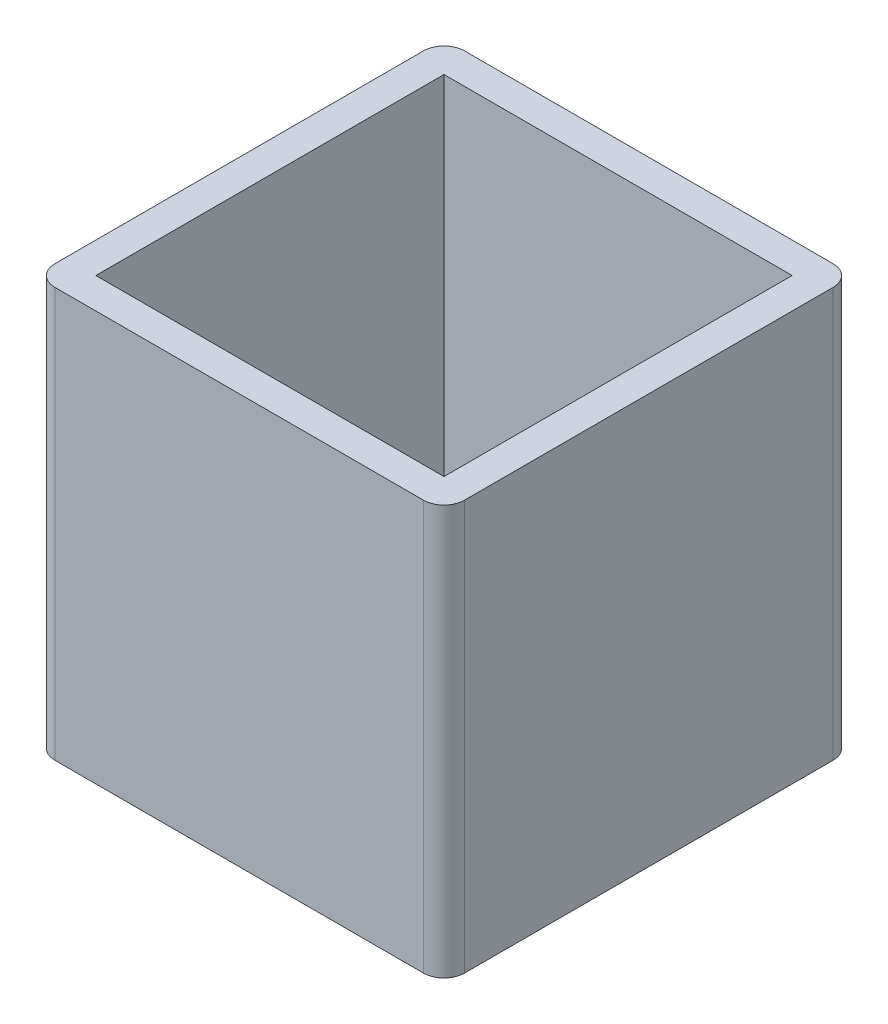
ISO-10303-21;
HEADER;
FILE_DESCRIPTION(('STEP AP214'),'2;1');
FILE_NAME('part.step','',(''),(''),'','','');
FILE_SCHEMA(('AUTOMOTIVE_DESIGN { 1 0 10303 214 1 1 1 1 }'));
ENDSEC;
DATA;
#1=APPLICATION_CONTEXT('core data for automotive mechanical design processes');
#2=APPLICATION_PROTOCOL_DEFINITION('international standard','automotive_design',2000,#1);
#3=PRODUCT_CONTEXT('',#1,'mechanical');
#4=PRODUCT('Part','Part','',(#3));
#5=PRODUCT_RELATED_PRODUCT_CATEGORY('part','',(#4));
#6=PRODUCT_DEFINITION_FORMATION('','',#4);
#7=PRODUCT_DEFINITION_CONTEXT('part definition',#1,'design');
#8=PRODUCT_DEFINITION('design','',#6,#7);
#9=PRODUCT_DEFINITION_SHAPE('','',#8);
#10=(LENGTH_UNIT() NAMED_UNIT(*) SI_UNIT(.MILLI.,.METRE.));
#11=(NAMED_UNIT(*) PLANE_ANGLE_UNIT() SI_UNIT($,.RADIAN.));
#12=(NAMED_UNIT(*) SI_UNIT($,.STERADIAN.) SOLID_ANGLE_UNIT());
#13=UNCERTAINTY_MEASURE_WITH_UNIT(LENGTH_MEASURE(1.E-05),#10,'distance_accuracy_value','');
#14=(GEOMETRIC_REPRESENTATION_CONTEXT(3) GLOBAL_UNCERTAINTY_ASSIGNED_CONTEXT((#13)) GLOBAL_UNIT_ASSIGNED_CONTEXT((#10,
#11,#12)) REPRESENTATION_CONTEXT('',''));
#15=CARTESIAN_POINT('',(0.,0.,0.));
#16=DIRECTION('',(0.,0.,1.));
#17=DIRECTION('',(1.,0.,0.));
#18=AXIS2_PLACEMENT_3D('',#15,#16,#17);
#19=CARTESIAN_POINT('',(0.,40.,0.));
#20=DIRECTION('',(0.,1.,0.));
#21=DIRECTION('',(0.,0.,1.));
#22=AXIS2_PLACEMENT_3D('',#19,#20,#21);
#23=PLANE('',#22);
#24=DIRECTION('',(-1.,0.,0.));
#25=VECTOR('',#24,1.);
#26=CARTESIAN_POINT('',(0.,40.,0.));
#27=LINE('',#26,#25);
#28=CARTESIAN_POINT('',(38.,40.,0.));
#29=VERTEX_POINT('',#28);
#30=CARTESIAN_POINT('',(2.,40.,0.));
#31=VERTEX_POINT('',#30);
#32=EDGE_CURVE('E180',#29,#31,#27,.T.);
#33=ORIENTED_EDGE('',*,*,#32,.T.);
#34=CARTESIAN_POINT('',(2.,40.,2.));
#35=DIRECTION('',(0.,1.,0.));
#36=DIRECTION('',(0.,0.,1.));
#37=AXIS2_PLACEMENT_3D('',#34,#35,#36);
#38=CIRCLE('',#37,2.);
#39=CARTESIAN_POINT('',(0.,40.,2.));
#40=VERTEX_POINT('',#39);
#41=EDGE_CURVE('E227',#31,#40,#38,.T.);
#42=ORIENTED_EDGE('',*,*,#41,.T.);
#43=DIRECTION('',(0.,0.,1.));
#44=VECTOR('',#43,1.);
#45=CARTESIAN_POINT('',(0.,40.,0.));
#46=LINE('',#45,#44);
#47=CARTESIAN_POINT('',(0.,40.,38.));
#48=VERTEX_POINT('',#47);
#49=EDGE_CURVE('E169',#40,#48,#46,.T.);
#50=ORIENTED_EDGE('',*,*,#49,.T.);
#51=CARTESIAN_POINT('',(2.,40.,38.));
#52=DIRECTION('',(0.,1.,0.));
#53=DIRECTION('',(0.,0.,1.));
#54=AXIS2_PLACEMENT_3D('',#51,#52,#53);
#55=CIRCLE('',#54,2.);
#56=CARTESIAN_POINT('',(2.,40.,40.));
#57=VERTEX_POINT('',#56);
#58=EDGE_CURVE('E224',#48,#57,#55,.T.);
#59=ORIENTED_EDGE('',*,*,#58,.T.);
#60=DIRECTION('',(1.,0.,0.));
#61=VECTOR('',#60,1.);
#62=CARTESIAN_POINT('',(0.,40.,40.));
#63=LINE('',#62,#61);
#64=CARTESIAN_POINT('',(38.,40.,40.));
#65=VERTEX_POINT('',#64);
#66=EDGE_CURVE('E173',#57,#65,#63,.T.);
#67=ORIENTED_EDGE('',*,*,#66,.T.);
#68=CARTESIAN_POINT('',(38.,40.,38.));
#69=DIRECTION('',(0.,1.,0.));
#70=DIRECTION('',(0.,0.,1.));
#71=AXIS2_PLACEMENT_3D('',#68,#69,#70);
#72=CIRCLE('',#71,2.);
#73=CARTESIAN_POINT('',(40.,40.,38.));
#74=VERTEX_POINT('',#73);
#75=EDGE_CURVE('E61',#65,#74,#72,.T.);
#76=ORIENTED_EDGE('',*,*,#75,.T.);
#77=DIRECTION('',(0.,0.,-1.));
#78=VECTOR('',#77,1.);
#79=CARTESIAN_POINT('',(40.,40.,0.));
#80=LINE('',#79,#78);
#81=CARTESIAN_POINT('',(40.,40.,2.));
#82=VERTEX_POINT('',#81);
#83=EDGE_CURVE('E177',#74,#82,#80,.T.);
#84=ORIENTED_EDGE('',*,*,#83,.T.);
#85=CARTESIAN_POINT('',(38.,40.,2.));
#86=DIRECTION('',(0.,1.,0.));
#87=DIRECTION('',(0.,0.,1.));
#88=AXIS2_PLACEMENT_3D('',#85,#86,#87);
#89=CIRCLE('',#88,2.);
#90=EDGE_CURVE('E219',#82,#29,#89,.T.);
#91=ORIENTED_EDGE('',*,*,#90,.T.);
#92=EDGE_LOOP('',(#33,#42,#50,#59,#67,#76,#84,#91));
#93=FACE_BOUND('',#92,.T.);
#94=DIRECTION('',(0.,0.,1.));
#95=VECTOR('',#94,1.);
#96=CARTESIAN_POINT('',(3.,40.,3.));
#97=LINE('',#96,#95);
#98=CARTESIAN_POINT('',(3.,40.,3.));
#99=VERTEX_POINT('',#98);
#100=CARTESIAN_POINT('',(3.,40.,37.));
#101=VERTEX_POINT('',#100);
#102=EDGE_CURVE('E151',#99,#101,#97,.T.);
#103=ORIENTED_EDGE('',*,*,#102,.F.);
#104=DIRECTION('',(1.,0.,0.));
#105=VECTOR('',#104,1.);
#106=CARTESIAN_POINT('',(3.,40.,3.));
#107=LINE('',#106,#105);
#108=CARTESIAN_POINT('',(37.,40.,3.));
#109=VERTEX_POINT('',#108);
#110=EDGE_CURVE('E403',#99,#109,#107,.T.);
#111=ORIENTED_EDGE('',*,*,#110,.T.);
#112=DIRECTION('',(0.,0.,1.));
#113=VECTOR('',#112,1.);
#114=CARTESIAN_POINT('',(37.,40.,3.));
#115=LINE('',#114,#113);
#116=CARTESIAN_POINT('',(37.,40.,37.));
#117=VERTEX_POINT('',#116);
#118=EDGE_CURVE('E155',#109,#117,#115,.T.);
#119=ORIENTED_EDGE('',*,*,#118,.T.);
#120=DIRECTION('',(1.,0.,0.));
#121=VECTOR('',#120,1.);
#122=CARTESIAN_POINT('',(3.,40.,37.));
#123=LINE('',#122,#121);
#124=EDGE_CURVE('E397',#101,#117,#123,.T.);
#125=ORIENTED_EDGE('',*,*,#124,.F.);
#126=EDGE_LOOP('',(#103,#111,#119,#125));
#127=FACE_BOUND('',#126,.T.);
#128=ADVANCED_FACE('F39',(#93,#127),#23,.T.);
#129=CARTESIAN_POINT('',(0.,40.,0.));
#130=DIRECTION('',(1.,0.,0.));
#131=DIRECTION('',(0.,0.,-1.));
#132=AXIS2_PLACEMENT_3D('',#129,#130,#131);
#133=PLANE('',#132);
#134=ORIENTED_EDGE('',*,*,#49,.F.);
#135=DIRECTION('',(0.,-1.,0.));
#136=VECTOR('',#135,1.);
#137=CARTESIAN_POINT('',(0.,40.,2.));
#138=LINE('',#137,#136);
#139=CARTESIAN_POINT('',(0.,0.,2.));
#140=VERTEX_POINT('',#139);
#141=EDGE_CURVE('E196',#40,#140,#138,.T.);
#142=ORIENTED_EDGE('',*,*,#141,.T.);
#143=DIRECTION('',(0.,0.,1.));
#144=VECTOR('',#143,1.);
#145=CARTESIAN_POINT('',(0.,0.,0.));
#146=LINE('',#145,#144);
#147=CARTESIAN_POINT('',(0.,0.,38.));
#148=VERTEX_POINT('',#147);
#149=EDGE_CURVE('E157',#140,#148,#146,.T.);
#150=ORIENTED_EDGE('',*,*,#149,.T.);
#151=DIRECTION('',(0.,-1.,0.));
#152=VECTOR('',#151,1.);
#153=CARTESIAN_POINT('',(0.,40.,38.));
#154=LINE('',#153,#152);
#155=EDGE_CURVE('E183',#148,#48,#154,.F.);
#156=ORIENTED_EDGE('',*,*,#155,.T.);
#157=EDGE_LOOP('',(#134,#142,#150,#156));
#158=FACE_BOUND('',#157,.T.);
#159=ADVANCED_FACE('F268',(#158),#133,.F.);
#160=CARTESIAN_POINT('',(0.,40.,40.));
#161=DIRECTION('',(0.,0.,-1.));
#162=DIRECTION('',(-1.,0.,0.));
#163=AXIS2_PLACEMENT_3D('',#160,#161,#162);
#164=PLANE('',#163);
#165=ORIENTED_EDGE('',*,*,#66,.F.);
#166=DIRECTION('',(0.,-1.,0.));
#167=VECTOR('',#166,1.);
#168=CARTESIAN_POINT('',(2.,40.,40.));
#169=LINE('',#168,#167);
#170=CARTESIAN_POINT('',(2.,0.,40.));
#171=VERTEX_POINT('',#170);
#172=EDGE_CURVE('E233',#57,#171,#169,.T.);
#173=ORIENTED_EDGE('',*,*,#172,.T.);
#174=DIRECTION('',(1.,0.,0.));
#175=VECTOR('',#174,1.);
#176=CARTESIAN_POINT('',(0.,0.,40.));
#177=LINE('',#176,#175);
#178=CARTESIAN_POINT('',(38.,0.,40.));
#179=VERTEX_POINT('',#178);
#180=EDGE_CURVE('E163',#171,#179,#177,.T.);
#181=ORIENTED_EDGE('',*,*,#180,.T.);
#182=DIRECTION('',(0.,-1.,0.));
#183=VECTOR('',#182,1.);
#184=CARTESIAN_POINT('',(38.,40.,40.));
#185=LINE('',#184,#183);
#186=EDGE_CURVE('E230',#179,#65,#185,.F.);
#187=ORIENTED_EDGE('',*,*,#186,.T.);
#188=EDGE_LOOP('',(#165,#173,#181,#187));
#189=FACE_BOUND('',#188,.T.);
#190=ADVANCED_FACE('F241',(#189),#164,.F.);
#191=CARTESIAN_POINT('',(40.,40.,0.));
#192=DIRECTION('',(-1.,0.,0.));
#193=DIRECTION('',(0.,0.,1.));
#194=AXIS2_PLACEMENT_3D('',#191,#192,#193);
#195=PLANE('',#194);
#196=ORIENTED_EDGE('',*,*,#83,.F.);
#197=DIRECTION('',(0.,-1.,0.));
#198=VECTOR('',#197,1.);
#199=CARTESIAN_POINT('',(40.,40.,38.));
#200=LINE('',#199,#198);
#201=CARTESIAN_POINT('',(40.,0.,38.));
#202=VERTEX_POINT('',#201);
#203=EDGE_CURVE('E11',#74,#202,#200,.T.);
#204=ORIENTED_EDGE('',*,*,#203,.T.);
#205=DIRECTION('',(0.,0.,-1.));
#206=VECTOR('',#205,1.);
#207=CARTESIAN_POINT('',(40.,0.,0.));
#208=LINE('',#207,#206);
#209=CARTESIAN_POINT('',(40.,0.,2.));
#210=VERTEX_POINT('',#209);
#211=EDGE_CURVE('E188',#202,#210,#208,.T.);
#212=ORIENTED_EDGE('',*,*,#211,.T.);
#213=DIRECTION('',(0.,-1.,0.));
#214=VECTOR('',#213,1.);
#215=CARTESIAN_POINT('',(40.,40.,2.));
#216=LINE('',#215,#214);
#217=EDGE_CURVE('E48',#210,#82,#216,.F.);
#218=ORIENTED_EDGE('',*,*,#217,.T.);
#219=EDGE_LOOP('',(#196,#204,#212,#218));
#220=FACE_BOUND('',#219,.T.);
#221=ADVANCED_FACE('F252',(#220),#195,.F.);
#222=CARTESIAN_POINT('',(0.,40.,0.));
#223=DIRECTION('',(0.,0.,1.));
#224=DIRECTION('',(1.,0.,0.));
#225=AXIS2_PLACEMENT_3D('',#222,#223,#224);
#226=PLANE('',#225);
#227=DIRECTION('',(-1.,0.,0.));
#228=VECTOR('',#227,1.);
#229=CARTESIAN_POINT('',(0.,0.,0.));
#230=LINE('',#229,#228);
#231=CARTESIAN_POINT('',(38.,0.,0.));
#232=VERTEX_POINT('',#231);
#233=CARTESIAN_POINT('',(2.,0.,0.));
#234=VERTEX_POINT('',#233);
#235=EDGE_CURVE('E174',#232,#234,#230,.T.);
#236=ORIENTED_EDGE('',*,*,#235,.T.);
#237=DIRECTION('',(0.,-1.,0.));
#238=VECTOR('',#237,1.);
#239=CARTESIAN_POINT('',(2.,40.,0.));
#240=LINE('',#239,#238);
#241=EDGE_CURVE('E216',#234,#31,#240,.F.);
#242=ORIENTED_EDGE('',*,*,#241,.T.);
#243=ORIENTED_EDGE('',*,*,#32,.F.);
#244=DIRECTION('',(0.,-1.,0.));
#245=VECTOR('',#244,1.);
#246=CARTESIAN_POINT('',(38.,40.,0.));
#247=LINE('',#246,#245);
#248=EDGE_CURVE('E212',#29,#232,#247,.T.);
#249=ORIENTED_EDGE('',*,*,#248,.T.);
#250=EDGE_LOOP('',(#236,#242,#243,#249));
#251=FACE_BOUND('',#250,.T.);
#252=ADVANCED_FACE('F260',(#251),#226,.F.);
#253=CARTESIAN_POINT('',(0.,0.,0.));
#254=DIRECTION('',(0.,1.,0.));
#255=DIRECTION('',(0.,0.,1.));
#256=AXIS2_PLACEMENT_3D('',#253,#254,#255);
#257=PLANE('',#256);
#258=ORIENTED_EDGE('',*,*,#149,.F.);
#259=CARTESIAN_POINT('',(2.,0.,2.));
#260=DIRECTION('',(0.,1.,0.));
#261=DIRECTION('',(0.,0.,1.));
#262=AXIS2_PLACEMENT_3D('',#259,#260,#261);
#263=CIRCLE('',#262,2.);
#264=EDGE_CURVE('E209',#140,#234,#263,.F.);
#265=ORIENTED_EDGE('',*,*,#264,.T.);
#266=ORIENTED_EDGE('',*,*,#235,.F.);
#267=CARTESIAN_POINT('',(38.,0.,2.));
#268=DIRECTION('',(0.,1.,0.));
#269=DIRECTION('',(0.,0.,1.));
#270=AXIS2_PLACEMENT_3D('',#267,#268,#269);
#271=CIRCLE('',#270,2.);
#272=EDGE_CURVE('E200',#232,#210,#271,.F.);
#273=ORIENTED_EDGE('',*,*,#272,.T.);
#274=ORIENTED_EDGE('',*,*,#211,.F.);
#275=CARTESIAN_POINT('',(38.,0.,38.));
#276=DIRECTION('',(0.,1.,0.));
#277=DIRECTION('',(0.,0.,1.));
#278=AXIS2_PLACEMENT_3D('',#275,#276,#277);
#279=CIRCLE('',#278,2.);
#280=EDGE_CURVE('E203',#202,#179,#279,.F.);
#281=ORIENTED_EDGE('',*,*,#280,.T.);
#282=ORIENTED_EDGE('',*,*,#180,.F.);
#283=CARTESIAN_POINT('',(2.,0.,38.));
#284=DIRECTION('',(0.,1.,0.));
#285=DIRECTION('',(0.,0.,1.));
#286=AXIS2_PLACEMENT_3D('',#283,#284,#285);
#287=CIRCLE('',#286,2.);
#288=EDGE_CURVE('E206',#171,#148,#287,.F.);
#289=ORIENTED_EDGE('',*,*,#288,.T.);
#290=EDGE_LOOP('',(#258,#265,#266,#273,#274,#281,#282,#289));
#291=FACE_BOUND('',#290,.T.);
#292=ADVANCED_FACE('F247',(#291),#257,.F.);
#293=CARTESIAN_POINT('',(3.,3.,3.));
#294=DIRECTION('',(0.,0.,1.));
#295=DIRECTION('',(1.,0.,0.));
#296=AXIS2_PLACEMENT_3D('',#293,#294,#295);
#297=PLANE('',#296);
#298=ORIENTED_EDGE('',*,*,#110,.F.);
#299=DIRECTION('',(0.,1.,0.));
#300=VECTOR('',#299,1.);
#301=CARTESIAN_POINT('',(3.,3.,3.));
#302=LINE('',#301,#300);
#303=CARTESIAN_POINT('',(3.,3.,3.));
#304=VERTEX_POINT('',#303);
#305=EDGE_CURVE('E149',#304,#99,#302,.T.);
#306=ORIENTED_EDGE('',*,*,#305,.F.);
#307=DIRECTION('',(1.,0.,0.));
#308=VECTOR('',#307,1.);
#309=CARTESIAN_POINT('',(3.,3.,3.));
#310=LINE('',#309,#308);
#311=CARTESIAN_POINT('',(37.,3.,3.));
#312=VERTEX_POINT('',#311);
#313=EDGE_CURVE('E134',#304,#312,#310,.T.);
#314=ORIENTED_EDGE('',*,*,#313,.T.);
#315=DIRECTION('',(0.,1.,0.));
#316=VECTOR('',#315,1.);
#317=CARTESIAN_POINT('',(37.,3.,3.));
#318=LINE('',#317,#316);
#319=EDGE_CURVE('E146',#312,#109,#318,.T.);
#320=ORIENTED_EDGE('',*,*,#319,.T.);
#321=EDGE_LOOP('',(#298,#306,#314,#320));
#322=FACE_BOUND('',#321,.T.);
#323=ADVANCED_FACE('F145',(#322),#297,.T.);
#324=CARTESIAN_POINT('',(37.,3.,3.));
#325=DIRECTION('',(-1.,0.,0.));
#326=DIRECTION('',(0.,0.,1.));
#327=AXIS2_PLACEMENT_3D('',#324,#325,#326);
#328=PLANE('',#327);
#329=ORIENTED_EDGE('',*,*,#118,.F.);
#330=ORIENTED_EDGE('',*,*,#319,.F.);
#331=DIRECTION('',(0.,0.,1.));
#332=VECTOR('',#331,1.);
#333=CARTESIAN_POINT('',(37.,3.,3.));
#334=LINE('',#333,#332);
#335=CARTESIAN_POINT('',(37.,3.,37.));
#336=VERTEX_POINT('',#335);
#337=EDGE_CURVE('E130',#312,#336,#334,.T.);
#338=ORIENTED_EDGE('',*,*,#337,.T.);
#339=DIRECTION('',(0.,1.,0.));
#340=VECTOR('',#339,1.);
#341=CARTESIAN_POINT('',(37.,3.,37.));
#342=LINE('',#341,#340);
#343=EDGE_CURVE('E158',#336,#117,#342,.T.);
#344=ORIENTED_EDGE('',*,*,#343,.T.);
#345=EDGE_LOOP('',(#329,#330,#338,#344));
#346=FACE_BOUND('',#345,.T.);
#347=ADVANCED_FACE('F153',(#346),#328,.T.);
#348=CARTESIAN_POINT('',(3.,3.,37.));
#349=DIRECTION('',(0.,0.,1.));
#350=DIRECTION('',(1.,0.,0.));
#351=AXIS2_PLACEMENT_3D('',#348,#349,#350);
#352=PLANE('',#351);
#353=ORIENTED_EDGE('',*,*,#124,.T.);
#354=ORIENTED_EDGE('',*,*,#343,.F.);
#355=DIRECTION('',(1.,0.,0.));
#356=VECTOR('',#355,1.);
#357=CARTESIAN_POINT('',(3.,3.,37.));
#358=LINE('',#357,#356);
#359=CARTESIAN_POINT('',(3.,3.,37.));
#360=VERTEX_POINT('',#359);
#361=EDGE_CURVE('E137',#360,#336,#358,.T.);
#362=ORIENTED_EDGE('',*,*,#361,.F.);
#363=DIRECTION('',(0.,1.,0.));
#364=VECTOR('',#363,1.);
#365=CARTESIAN_POINT('',(3.,3.,37.));
#366=LINE('',#365,#364);
#367=EDGE_CURVE('E165',#360,#101,#366,.T.);
#368=ORIENTED_EDGE('',*,*,#367,.T.);
#369=EDGE_LOOP('',(#353,#354,#362,#368));
#370=FACE_BOUND('',#369,.T.);
#371=ADVANCED_FACE('F322',(#370),#352,.F.);
#372=CARTESIAN_POINT('',(3.,3.,3.));
#373=DIRECTION('',(-1.,0.,0.));
#374=DIRECTION('',(0.,0.,1.));
#375=AXIS2_PLACEMENT_3D('',#372,#373,#374);
#376=PLANE('',#375);
#377=ORIENTED_EDGE('',*,*,#102,.T.);
#378=ORIENTED_EDGE('',*,*,#367,.F.);
#379=DIRECTION('',(0.,0.,1.));
#380=VECTOR('',#379,1.);
#381=CARTESIAN_POINT('',(3.,3.,3.));
#382=LINE('',#381,#380);
#383=EDGE_CURVE('E408',#304,#360,#382,.T.);
#384=ORIENTED_EDGE('',*,*,#383,.F.);
#385=ORIENTED_EDGE('',*,*,#305,.T.);
#386=EDGE_LOOP('',(#377,#378,#384,#385));
#387=FACE_BOUND('',#386,.T.);
#388=ADVANCED_FACE('F328',(#387),#376,.F.);
#389=CARTESIAN_POINT('',(0.,3.,0.));
#390=DIRECTION('',(0.,-1.,0.));
#391=DIRECTION('',(0.,0.,-1.));
#392=AXIS2_PLACEMENT_3D('',#389,#390,#391);
#393=PLANE('',#392);
#394=ORIENTED_EDGE('',*,*,#313,.F.);
#395=ORIENTED_EDGE('',*,*,#383,.T.);
#396=ORIENTED_EDGE('',*,*,#361,.T.);
#397=ORIENTED_EDGE('',*,*,#337,.F.);
#398=EDGE_LOOP('',(#394,#395,#396,#397));
#399=FACE_BOUND('',#398,.T.);
#400=ADVANCED_FACE('F132',(#399),#393,.F.);
#401=CARTESIAN_POINT('',(2.,40.,2.));
#402=DIRECTION('',(0.,-1.,0.));
#403=DIRECTION('',(0.,0.,-1.));
#404=AXIS2_PLACEMENT_3D('',#401,#402,#403);
#405=CYLINDRICAL_SURFACE('',#404,2.);
#406=ORIENTED_EDGE('',*,*,#41,.F.);
#407=ORIENTED_EDGE('',*,*,#241,.F.);
#408=ORIENTED_EDGE('',*,*,#264,.F.);
#409=ORIENTED_EDGE('',*,*,#141,.F.);
#410=EDGE_LOOP('',(#406,#407,#408,#409));
#411=FACE_BOUND('',#410,.T.);
#412=ADVANCED_FACE('F265',(#411),#405,.T.);
#413=CARTESIAN_POINT('',(2.,40.,38.));
#414=DIRECTION('',(0.,-1.,0.));
#415=DIRECTION('',(0.,0.,-1.));
#416=AXIS2_PLACEMENT_3D('',#413,#414,#415);
#417=CYLINDRICAL_SURFACE('',#416,2.);
#418=ORIENTED_EDGE('',*,*,#58,.F.);
#419=ORIENTED_EDGE('',*,*,#155,.F.);
#420=ORIENTED_EDGE('',*,*,#288,.F.);
#421=ORIENTED_EDGE('',*,*,#172,.F.);
#422=EDGE_LOOP('',(#418,#419,#420,#421));
#423=FACE_BOUND('',#422,.T.);
#424=ADVANCED_FACE('F270',(#423),#417,.T.);
#425=CARTESIAN_POINT('',(38.,40.,38.));
#426=DIRECTION('',(0.,-1.,0.));
#427=DIRECTION('',(0.,0.,-1.));
#428=AXIS2_PLACEMENT_3D('',#425,#426,#427);
#429=CYLINDRICAL_SURFACE('',#428,2.);
#430=ORIENTED_EDGE('',*,*,#75,.F.);
#431=ORIENTED_EDGE('',*,*,#186,.F.);
#432=ORIENTED_EDGE('',*,*,#280,.F.);
#433=ORIENTED_EDGE('',*,*,#203,.F.);
#434=EDGE_LOOP('',(#430,#431,#432,#433));
#435=FACE_BOUND('',#434,.T.);
#436=ADVANCED_FACE('F251',(#435),#429,.T.);
#437=CARTESIAN_POINT('',(38.,40.,2.));
#438=DIRECTION('',(0.,-1.,0.));
#439=DIRECTION('',(0.,0.,-1.));
#440=AXIS2_PLACEMENT_3D('',#437,#438,#439);
#441=CYLINDRICAL_SURFACE('',#440,2.);
#442=ORIENTED_EDGE('',*,*,#90,.F.);
#443=ORIENTED_EDGE('',*,*,#217,.F.);
#444=ORIENTED_EDGE('',*,*,#272,.F.);
#445=ORIENTED_EDGE('',*,*,#248,.F.);
#446=EDGE_LOOP('',(#442,#443,#444,#445));
#447=FACE_BOUND('',#446,.T.);
#448=ADVANCED_FACE('F41',(#447),#441,.T.);
#449=CLOSED_SHELL('',(#128,#159,#190,#221,#252,#292,#323,#347,#371,#388,#400,#412,#424,#436,#448));
#450=MANIFOLD_SOLID_BREP('B2',#449);
#451=ADVANCED_BREP_SHAPE_REPRESENTATION('',(#18,#450),#14);
#452=SHAPE_DEFINITION_REPRESENTATION(#9,#451);
ENDSEC;
END-ISO-10303-21;
